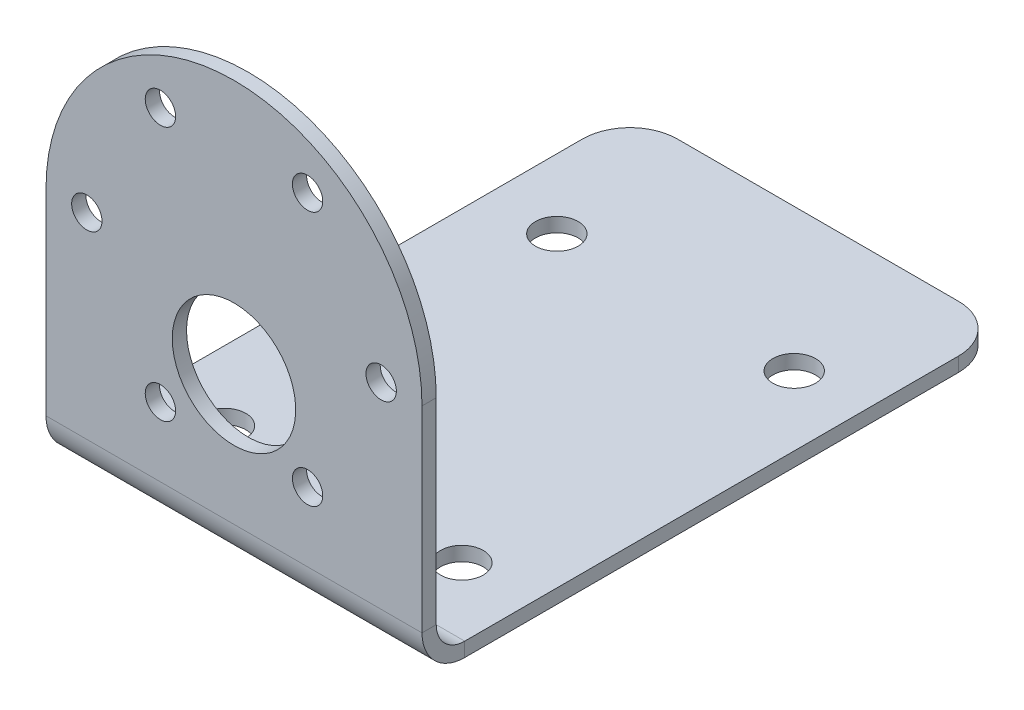
ISO-10303-21;
HEADER;
FILE_DESCRIPTION(('STEP AP214'),'2;1');
FILE_NAME('part.step','',(''),(''),'','','');
FILE_SCHEMA(('AUTOMOTIVE_DESIGN { 1 0 10303 214 1 1 1 1 }'));
ENDSEC;
DATA;
#1=APPLICATION_CONTEXT('core data for automotive mechanical design processes');
#2=APPLICATION_PROTOCOL_DEFINITION('international standard','automotive_design',2000,#1);
#3=PRODUCT_CONTEXT('',#1,'mechanical');
#4=PRODUCT('Part','Part','',(#3));
#5=PRODUCT_RELATED_PRODUCT_CATEGORY('part','',(#4));
#6=PRODUCT_DEFINITION_FORMATION('','',#4);
#7=PRODUCT_DEFINITION_CONTEXT('part definition',#1,'design');
#8=PRODUCT_DEFINITION('design','',#6,#7);
#9=PRODUCT_DEFINITION_SHAPE('','',#8);
#10=(LENGTH_UNIT() NAMED_UNIT(*) SI_UNIT(.MILLI.,.METRE.));
#11=(NAMED_UNIT(*) PLANE_ANGLE_UNIT() SI_UNIT($,.RADIAN.));
#12=(NAMED_UNIT(*) SI_UNIT($,.STERADIAN.) SOLID_ANGLE_UNIT());
#13=UNCERTAINTY_MEASURE_WITH_UNIT(LENGTH_MEASURE(1.E-05),#10,'distance_accuracy_value','');
#14=(GEOMETRIC_REPRESENTATION_CONTEXT(3) GLOBAL_UNCERTAINTY_ASSIGNED_CONTEXT((#13)) GLOBAL_UNIT_ASSIGNED_CONTEXT((#10,
#11,#12)) REPRESENTATION_CONTEXT('',''));
#15=CARTESIAN_POINT('',(0.,0.,0.));
#16=DIRECTION('',(0.,0.,1.));
#17=DIRECTION('',(1.,0.,0.));
#18=AXIS2_PLACEMENT_3D('',#15,#16,#17);
#19=CARTESIAN_POINT('',(19.8,-16.7,-60.));
#20=DIRECTION('',(1.,0.,0.));
#21=DIRECTION('',(0.,0.,1.));
#22=AXIS2_PLACEMENT_3D('',#19,#20,#21);
#23=PLANE('',#22);
#24=DIRECTION('',(0.,1.,0.));
#25=VECTOR('',#24,1.);
#26=CARTESIAN_POINT('',(19.8,-16.7,-3.));
#27=LINE('',#26,#25);
#28=CARTESIAN_POINT('',(19.8,-18.2,-3.));
#29=VERTEX_POINT('',#28);
#30=CARTESIAN_POINT('',(19.8,-16.7,-3.));
#31=VERTEX_POINT('',#30);
#32=EDGE_CURVE('E11',#29,#31,#27,.T.);
#33=ORIENTED_EDGE('',*,*,#32,.F.);
#34=DIRECTION('',(0.,0.,1.));
#35=VECTOR('',#34,1.);
#36=CARTESIAN_POINT('',(19.8,-18.2,-60.));
#37=LINE('',#36,#35);
#38=CARTESIAN_POINT('',(19.8,-18.2,-55.));
#39=VERTEX_POINT('',#38);
#40=EDGE_CURVE('E143',#39,#29,#37,.T.);
#41=ORIENTED_EDGE('',*,*,#40,.F.);
#42=DIRECTION('',(0.,1.,0.));
#43=VECTOR('',#42,1.);
#44=CARTESIAN_POINT('',(19.8,-16.7,-55.));
#45=LINE('',#44,#43);
#46=CARTESIAN_POINT('',(19.8,-16.7,-55.));
#47=VERTEX_POINT('',#46);
#48=EDGE_CURVE('E46',#39,#47,#45,.T.);
#49=ORIENTED_EDGE('',*,*,#48,.T.);
#50=DIRECTION('',(0.,0.,1.));
#51=VECTOR('',#50,1.);
#52=CARTESIAN_POINT('',(19.8,-16.7,-60.));
#53=LINE('',#52,#51);
#54=EDGE_CURVE('E204',#47,#31,#53,.T.);
#55=ORIENTED_EDGE('',*,*,#54,.T.);
#56=EDGE_LOOP('',(#33,#41,#49,#55));
#57=FACE_BOUND('',#56,.T.);
#58=ADVANCED_FACE('F36',(#57),#23,.T.);
#59=CARTESIAN_POINT('',(14.8,-16.7,-55.));
#60=DIRECTION('',(0.,-1.,0.));
#61=DIRECTION('',(1.,0.,0.));
#62=AXIS2_PLACEMENT_3D('',#59,#60,#61);
#63=CYLINDRICAL_SURFACE('',#62,5.);
#64=ORIENTED_EDGE('',*,*,#48,.F.);
#65=CARTESIAN_POINT('',(14.8,-18.2,-55.));
#66=DIRECTION('',(0.,1.,0.));
#67=DIRECTION('',(-1.,0.,0.));
#68=AXIS2_PLACEMENT_3D('',#65,#66,#67);
#69=CIRCLE('',#68,5.);
#70=CARTESIAN_POINT('',(14.8,-18.2,-60.));
#71=VERTEX_POINT('',#70);
#72=EDGE_CURVE('E151',#71,#39,#69,.F.);
#73=ORIENTED_EDGE('',*,*,#72,.F.);
#74=DIRECTION('',(0.,1.,0.));
#75=VECTOR('',#74,1.);
#76=CARTESIAN_POINT('',(14.8,-16.7,-60.));
#77=LINE('',#76,#75);
#78=CARTESIAN_POINT('',(14.8,-16.7,-60.));
#79=VERTEX_POINT('',#78);
#80=EDGE_CURVE('E198',#71,#79,#77,.T.);
#81=ORIENTED_EDGE('',*,*,#80,.T.);
#82=CARTESIAN_POINT('',(14.8,-16.7,-55.));
#83=DIRECTION('',(0.,1.,0.));
#84=DIRECTION('',(-1.,0.,0.));
#85=AXIS2_PLACEMENT_3D('',#82,#83,#84);
#86=CIRCLE('',#85,5.);
#87=EDGE_CURVE('E218',#79,#47,#86,.F.);
#88=ORIENTED_EDGE('',*,*,#87,.T.);
#89=EDGE_LOOP('',(#64,#73,#81,#88));
#90=FACE_BOUND('',#89,.T.);
#91=ADVANCED_FACE('F224',(#90),#63,.T.);
#92=CARTESIAN_POINT('',(0.,-16.7,-60.));
#93=DIRECTION('',(0.,0.,-1.));
#94=DIRECTION('',(1.,0.,0.));
#95=AXIS2_PLACEMENT_3D('',#92,#93,#94);
#96=PLANE('',#95);
#97=ORIENTED_EDGE('',*,*,#80,.F.);
#98=DIRECTION('',(1.,0.,0.));
#99=VECTOR('',#98,1.);
#100=CARTESIAN_POINT('',(0.,-18.2,-60.));
#101=LINE('',#100,#99);
#102=CARTESIAN_POINT('',(-14.8,-18.2,-60.));
#103=VERTEX_POINT('',#102);
#104=EDGE_CURVE('E147',#103,#71,#101,.T.);
#105=ORIENTED_EDGE('',*,*,#104,.F.);
#106=DIRECTION('',(0.,1.,0.));
#107=VECTOR('',#106,1.);
#108=CARTESIAN_POINT('',(-14.8,-16.7,-60.));
#109=LINE('',#108,#107);
#110=CARTESIAN_POINT('',(-14.8,-16.7,-60.));
#111=VERTEX_POINT('',#110);
#112=EDGE_CURVE('E195',#103,#111,#109,.T.);
#113=ORIENTED_EDGE('',*,*,#112,.T.);
#114=DIRECTION('',(1.,0.,0.));
#115=VECTOR('',#114,1.);
#116=CARTESIAN_POINT('',(0.,-16.7,-60.));
#117=LINE('',#116,#115);
#118=EDGE_CURVE('E276',#111,#79,#117,.T.);
#119=ORIENTED_EDGE('',*,*,#118,.T.);
#120=EDGE_LOOP('',(#97,#105,#113,#119));
#121=FACE_BOUND('',#120,.T.);
#122=ADVANCED_FACE('F298',(#121),#96,.T.);
#123=CARTESIAN_POINT('',(-14.8,-16.7,-55.));
#124=DIRECTION('',(0.,-1.,0.));
#125=DIRECTION('',(1.,0.,0.));
#126=AXIS2_PLACEMENT_3D('',#123,#124,#125);
#127=CYLINDRICAL_SURFACE('',#126,5.);
#128=ORIENTED_EDGE('',*,*,#112,.F.);
#129=CARTESIAN_POINT('',(-14.8,-18.2,-55.));
#130=DIRECTION('',(0.,-1.,0.));
#131=DIRECTION('',(1.,0.,0.));
#132=AXIS2_PLACEMENT_3D('',#129,#130,#131);
#133=CIRCLE('',#132,5.);
#134=CARTESIAN_POINT('',(-19.8,-18.2,-55.));
#135=VERTEX_POINT('',#134);
#136=EDGE_CURVE('E144',#103,#135,#133,.F.);
#137=ORIENTED_EDGE('',*,*,#136,.T.);
#138=DIRECTION('',(0.,1.,0.));
#139=VECTOR('',#138,1.);
#140=CARTESIAN_POINT('',(-19.8,-16.7,-55.));
#141=LINE('',#140,#139);
#142=CARTESIAN_POINT('',(-19.8,-16.7,-55.));
#143=VERTEX_POINT('',#142);
#144=EDGE_CURVE('E192',#135,#143,#141,.T.);
#145=ORIENTED_EDGE('',*,*,#144,.T.);
#146=CARTESIAN_POINT('',(-14.8,-16.7,-55.));
#147=DIRECTION('',(0.,-1.,0.));
#148=DIRECTION('',(1.,0.,0.));
#149=AXIS2_PLACEMENT_3D('',#146,#147,#148);
#150=CIRCLE('',#149,5.);
#151=EDGE_CURVE('E280',#111,#143,#150,.F.);
#152=ORIENTED_EDGE('',*,*,#151,.F.);
#153=EDGE_LOOP('',(#128,#137,#145,#152));
#154=FACE_BOUND('',#153,.T.);
#155=ADVANCED_FACE('F301',(#154),#127,.T.);
#156=CARTESIAN_POINT('',(-19.8,-16.7,-60.));
#157=DIRECTION('',(1.,0.,0.));
#158=DIRECTION('',(0.,0.,1.));
#159=AXIS2_PLACEMENT_3D('',#156,#157,#158);
#160=PLANE('',#159);
#161=ORIENTED_EDGE('',*,*,#144,.F.);
#162=DIRECTION('',(0.,0.,1.));
#163=VECTOR('',#162,1.);
#164=CARTESIAN_POINT('',(-19.8,-18.2,-60.));
#165=LINE('',#164,#163);
#166=CARTESIAN_POINT('',(-19.8,-18.2,-3.));
#167=VERTEX_POINT('',#166);
#168=EDGE_CURVE('E140',#135,#167,#165,.T.);
#169=ORIENTED_EDGE('',*,*,#168,.T.);
#170=DIRECTION('',(0.,1.,0.));
#171=VECTOR('',#170,1.);
#172=CARTESIAN_POINT('',(-19.8,-16.7,-3.));
#173=LINE('',#172,#171);
#174=CARTESIAN_POINT('',(-19.8,-16.7,-3.));
#175=VERTEX_POINT('',#174);
#176=EDGE_CURVE('E189',#167,#175,#173,.T.);
#177=ORIENTED_EDGE('',*,*,#176,.T.);
#178=DIRECTION('',(0.,0.,1.));
#179=VECTOR('',#178,1.);
#180=CARTESIAN_POINT('',(-19.8,-16.7,-60.));
#181=LINE('',#180,#179);
#182=EDGE_CURVE('E222',#143,#175,#181,.T.);
#183=ORIENTED_EDGE('',*,*,#182,.F.);
#184=EDGE_LOOP('',(#161,#169,#177,#183));
#185=FACE_BOUND('',#184,.T.);
#186=ADVANCED_FACE('F303',(#185),#160,.F.);
#187=CARTESIAN_POINT('',(-19.8,-13.7,-3.));
#188=DIRECTION('',(1.,0.,0.));
#189=DIRECTION('',(0.,1.,0.));
#190=AXIS2_PLACEMENT_3D('',#187,#188,#189);
#191=PLANE('',#190);
#192=ORIENTED_EDGE('',*,*,#176,.F.);
#193=CARTESIAN_POINT('',(-19.8,-13.7,-3.));
#194=DIRECTION('',(1.,0.,0.));
#195=DIRECTION('',(0.,1.,0.));
#196=AXIS2_PLACEMENT_3D('',#193,#194,#195);
#197=CIRCLE('',#196,4.5);
#198=CARTESIAN_POINT('',(-19.8,-13.7,1.5));
#199=VERTEX_POINT('',#198);
#200=EDGE_CURVE('E126',#167,#199,#197,.F.);
#201=ORIENTED_EDGE('',*,*,#200,.T.);
#202=DIRECTION('',(0.,0.,-1.));
#203=VECTOR('',#202,1.);
#204=CARTESIAN_POINT('',(-19.8,-13.7,0.));
#205=LINE('',#204,#203);
#206=CARTESIAN_POINT('',(-19.8,-13.7,0.));
#207=VERTEX_POINT('',#206);
#208=EDGE_CURVE('E54',#199,#207,#205,.T.);
#209=ORIENTED_EDGE('',*,*,#208,.T.);
#210=CARTESIAN_POINT('',(-19.8,-13.7,-3.));
#211=DIRECTION('',(-1.,0.,0.));
#212=DIRECTION('',(0.,-1.,0.));
#213=AXIS2_PLACEMENT_3D('',#210,#211,#212);
#214=CIRCLE('',#213,3.);
#215=EDGE_CURVE('E267',#175,#207,#214,.T.);
#216=ORIENTED_EDGE('',*,*,#215,.F.);
#217=EDGE_LOOP('',(#192,#201,#209,#216));
#218=FACE_BOUND('',#217,.T.);
#219=ADVANCED_FACE('F288',(#218),#191,.F.);
#220=CARTESIAN_POINT('',(-19.8,7.,0.));
#221=DIRECTION('',(1.,0.,0.));
#222=DIRECTION('',(0.,-1.,0.));
#223=AXIS2_PLACEMENT_3D('',#220,#221,#222);
#224=PLANE('',#223);
#225=ORIENTED_EDGE('',*,*,#208,.F.);
#226=DIRECTION('',(0.,1.,0.));
#227=VECTOR('',#226,1.);
#228=CARTESIAN_POINT('',(-19.8,0.,1.5));
#229=LINE('',#228,#227);
#230=CARTESIAN_POINT('',(-19.8,7.,1.5));
#231=VERTEX_POINT('',#230);
#232=EDGE_CURVE('E118',#231,#199,#229,.F.);
#233=ORIENTED_EDGE('',*,*,#232,.F.);
#234=DIRECTION('',(0.,0.,-1.));
#235=VECTOR('',#234,1.);
#236=CARTESIAN_POINT('',(-19.8,7.,0.));
#237=LINE('',#236,#235);
#238=CARTESIAN_POINT('',(-19.8,7.,0.));
#239=VERTEX_POINT('',#238);
#240=EDGE_CURVE('E185',#231,#239,#237,.T.);
#241=ORIENTED_EDGE('',*,*,#240,.T.);
#242=DIRECTION('',(0.,-1.,0.));
#243=VECTOR('',#242,1.);
#244=CARTESIAN_POINT('',(-19.8,7.,0.));
#245=LINE('',#244,#243);
#246=EDGE_CURVE('E239',#239,#207,#245,.T.);
#247=ORIENTED_EDGE('',*,*,#246,.T.);
#248=EDGE_LOOP('',(#225,#233,#241,#247));
#249=FACE_BOUND('',#248,.T.);
#250=ADVANCED_FACE('F394',(#249),#224,.F.);
#251=CARTESIAN_POINT('',(0.,7.,0.));
#252=DIRECTION('',(0.,0.,-1.));
#253=DIRECTION('',(-1.,0.,0.));
#254=AXIS2_PLACEMENT_3D('',#251,#252,#253);
#255=CYLINDRICAL_SURFACE('',#254,19.8);
#256=ORIENTED_EDGE('',*,*,#240,.F.);
#257=CARTESIAN_POINT('',(0.,7.,1.5));
#258=DIRECTION('',(0.,0.,1.));
#259=DIRECTION('',(1.,0.,0.));
#260=AXIS2_PLACEMENT_3D('',#257,#258,#259);
#261=CIRCLE('',#260,19.8);
#262=CARTESIAN_POINT('',(19.8,7.,1.5));
#263=VERTEX_POINT('',#262);
#264=EDGE_CURVE('E130',#263,#231,#261,.T.);
#265=ORIENTED_EDGE('',*,*,#264,.F.);
#266=DIRECTION('',(0.,0.,-1.));
#267=VECTOR('',#266,1.);
#268=CARTESIAN_POINT('',(19.8,7.,0.));
#269=LINE('',#268,#267);
#270=CARTESIAN_POINT('',(19.8,7.,0.));
#271=VERTEX_POINT('',#270);
#272=EDGE_CURVE('E105',#263,#271,#269,.T.);
#273=ORIENTED_EDGE('',*,*,#272,.T.);
#274=CARTESIAN_POINT('',(0.,7.,0.));
#275=DIRECTION('',(0.,0.,1.));
#276=DIRECTION('',(-1.,0.,0.));
#277=AXIS2_PLACEMENT_3D('',#274,#275,#276);
#278=CIRCLE('',#277,19.8);
#279=EDGE_CURVE('E234',#271,#239,#278,.T.);
#280=ORIENTED_EDGE('',*,*,#279,.T.);
#281=EDGE_LOOP('',(#256,#265,#273,#280));
#282=FACE_BOUND('',#281,.T.);
#283=ADVANCED_FACE('F391',(#282),#255,.T.);
#284=CARTESIAN_POINT('',(19.8,7.,0.));
#285=DIRECTION('',(1.,0.,0.));
#286=DIRECTION('',(0.,-1.,0.));
#287=AXIS2_PLACEMENT_3D('',#284,#285,#286);
#288=PLANE('',#287);
#289=ORIENTED_EDGE('',*,*,#272,.F.);
#290=DIRECTION('',(0.,1.,0.));
#291=VECTOR('',#290,1.);
#292=CARTESIAN_POINT('',(19.8,0.,1.5));
#293=LINE('',#292,#291);
#294=CARTESIAN_POINT('',(19.8,-13.7,1.5));
#295=VERTEX_POINT('',#294);
#296=EDGE_CURVE('E115',#263,#295,#293,.F.);
#297=ORIENTED_EDGE('',*,*,#296,.T.);
#298=DIRECTION('',(0.,0.,-1.));
#299=VECTOR('',#298,1.);
#300=CARTESIAN_POINT('',(19.8,-13.7,0.));
#301=LINE('',#300,#299);
#302=CARTESIAN_POINT('',(19.8,-13.7,0.));
#303=VERTEX_POINT('',#302);
#304=EDGE_CURVE('E40',#295,#303,#301,.T.);
#305=ORIENTED_EDGE('',*,*,#304,.T.);
#306=DIRECTION('',(0.,-1.,0.));
#307=VECTOR('',#306,1.);
#308=CARTESIAN_POINT('',(19.8,7.,0.));
#309=LINE('',#308,#307);
#310=EDGE_CURVE('E237',#271,#303,#309,.T.);
#311=ORIENTED_EDGE('',*,*,#310,.F.);
#312=EDGE_LOOP('',(#289,#297,#305,#311));
#313=FACE_BOUND('',#312,.T.);
#314=ADVANCED_FACE('F128',(#313),#288,.T.);
#315=CARTESIAN_POINT('',(-12.5,-16.7,-9.99999999999999));
#316=DIRECTION('',(0.,-1.,0.));
#317=DIRECTION('',(1.,0.,0.));
#318=AXIS2_PLACEMENT_3D('',#315,#316,#317);
#319=CYLINDRICAL_SURFACE('',#318,2.25);
#320=CARTESIAN_POINT('',(-12.5,-16.7,-9.99999999999999));
#321=DIRECTION('',(0.,1.,0.));
#322=DIRECTION('',(0.,0.,1.));
#323=AXIS2_PLACEMENT_3D('',#320,#321,#322);
#324=CIRCLE('',#323,2.25);
#325=CARTESIAN_POINT('',(-12.5,-16.7,-7.74999999999999));
#326=VERTEX_POINT('',#325);
#327=EDGE_CURVE('E268',#326,#326,#324,.T.);
#328=ORIENTED_EDGE('',*,*,#327,.T.);
#329=EDGE_LOOP('',(#328));
#330=FACE_BOUND('',#329,.T.);
#331=CARTESIAN_POINT('',(-12.5,-18.2,-9.99999999999999));
#332=DIRECTION('',(0.,1.,0.));
#333=DIRECTION('',(0.,0.,1.));
#334=AXIS2_PLACEMENT_3D('',#331,#332,#333);
#335=CIRCLE('',#334,2.25);
#336=CARTESIAN_POINT('',(-12.5,-18.2,-7.74999999999999));
#337=VERTEX_POINT('',#336);
#338=EDGE_CURVE('E139',#337,#337,#335,.T.);
#339=ORIENTED_EDGE('',*,*,#338,.F.);
#340=EDGE_LOOP('',(#339));
#341=FACE_BOUND('',#340,.T.);
#342=ADVANCED_FACE('F362',(#330,#341),#319,.F.);
#343=CARTESIAN_POINT('',(-12.5,-16.7,-45.));
#344=DIRECTION('',(0.,-1.,0.));
#345=DIRECTION('',(1.,0.,0.));
#346=AXIS2_PLACEMENT_3D('',#343,#344,#345);
#347=CYLINDRICAL_SURFACE('',#346,2.25);
#348=CARTESIAN_POINT('',(-12.5,-16.7,-45.));
#349=DIRECTION('',(0.,1.,0.));
#350=DIRECTION('',(0.,0.,1.));
#351=AXIS2_PLACEMENT_3D('',#348,#349,#350);
#352=CIRCLE('',#351,2.25);
#353=CARTESIAN_POINT('',(-12.5,-16.7,-42.75));
#354=VERTEX_POINT('',#353);
#355=EDGE_CURVE('E271',#354,#354,#352,.T.);
#356=ORIENTED_EDGE('',*,*,#355,.T.);
#357=EDGE_LOOP('',(#356));
#358=FACE_BOUND('',#357,.T.);
#359=CARTESIAN_POINT('',(-12.5,-18.2,-45.));
#360=DIRECTION('',(0.,1.,0.));
#361=DIRECTION('',(0.,0.,1.));
#362=AXIS2_PLACEMENT_3D('',#359,#360,#361);
#363=CIRCLE('',#362,2.25);
#364=CARTESIAN_POINT('',(-12.5,-18.2,-42.75));
#365=VERTEX_POINT('',#364);
#366=EDGE_CURVE('E150',#365,#365,#363,.T.);
#367=ORIENTED_EDGE('',*,*,#366,.F.);
#368=EDGE_LOOP('',(#367));
#369=FACE_BOUND('',#368,.T.);
#370=ADVANCED_FACE('F323',(#358,#369),#347,.F.);
#371=CARTESIAN_POINT('',(12.5,-16.7,-9.99999999999999));
#372=DIRECTION('',(0.,-1.,0.));
#373=DIRECTION('',(1.,0.,0.));
#374=AXIS2_PLACEMENT_3D('',#371,#372,#373);
#375=CYLINDRICAL_SURFACE('',#374,2.25);
#376=CARTESIAN_POINT('',(12.5,-16.7,-9.99999999999999));
#377=DIRECTION('',(0.,-1.,0.));
#378=DIRECTION('',(0.,0.,1.));
#379=AXIS2_PLACEMENT_3D('',#376,#377,#378);
#380=CIRCLE('',#379,2.25);
#381=CARTESIAN_POINT('',(12.5,-16.7,-7.74999999999999));
#382=VERTEX_POINT('',#381);
#383=EDGE_CURVE('E225',#382,#382,#380,.T.);
#384=ORIENTED_EDGE('',*,*,#383,.F.);
#385=EDGE_LOOP('',(#384));
#386=FACE_BOUND('',#385,.T.);
#387=CARTESIAN_POINT('',(12.5,-18.2,-9.99999999999999));
#388=DIRECTION('',(0.,-1.,0.));
#389=DIRECTION('',(0.,0.,-1.));
#390=AXIS2_PLACEMENT_3D('',#387,#388,#389);
#391=CIRCLE('',#390,2.25);
#392=CARTESIAN_POINT('',(12.5,-18.2,-12.25));
#393=VERTEX_POINT('',#392);
#394=EDGE_CURVE('E154',#393,#393,#391,.T.);
#395=ORIENTED_EDGE('',*,*,#394,.T.);
#396=EDGE_LOOP('',(#395));
#397=FACE_BOUND('',#396,.T.);
#398=ADVANCED_FACE('F315',(#386,#397),#375,.F.);
#399=CARTESIAN_POINT('',(12.5,-16.7,-45.));
#400=DIRECTION('',(0.,-1.,0.));
#401=DIRECTION('',(1.,0.,0.));
#402=AXIS2_PLACEMENT_3D('',#399,#400,#401);
#403=CYLINDRICAL_SURFACE('',#402,2.25);
#404=CARTESIAN_POINT('',(12.5,-16.7,-45.));
#405=DIRECTION('',(0.,-1.,0.));
#406=DIRECTION('',(0.,0.,1.));
#407=AXIS2_PLACEMENT_3D('',#404,#405,#406);
#408=CIRCLE('',#407,2.25);
#409=CARTESIAN_POINT('',(12.5,-16.7,-42.75));
#410=VERTEX_POINT('',#409);
#411=EDGE_CURVE('E228',#410,#410,#408,.T.);
#412=ORIENTED_EDGE('',*,*,#411,.F.);
#413=EDGE_LOOP('',(#412));
#414=FACE_BOUND('',#413,.T.);
#415=CARTESIAN_POINT('',(12.5,-18.2,-45.));
#416=DIRECTION('',(0.,-1.,0.));
#417=DIRECTION('',(0.,0.,-1.));
#418=AXIS2_PLACEMENT_3D('',#415,#416,#417);
#419=CIRCLE('',#418,2.25);
#420=CARTESIAN_POINT('',(12.5,-18.2,-47.25));
#421=VERTEX_POINT('',#420);
#422=EDGE_CURVE('E134',#421,#421,#419,.T.);
#423=ORIENTED_EDGE('',*,*,#422,.T.);
#424=EDGE_LOOP('',(#423));
#425=FACE_BOUND('',#424,.T.);
#426=ADVANCED_FACE('F38',(#414,#425),#403,.F.);
#427=CARTESIAN_POINT('',(19.8,-13.7,-3.));
#428=DIRECTION('',(-1.,0.,0.));
#429=DIRECTION('',(0.,-1.,0.));
#430=AXIS2_PLACEMENT_3D('',#427,#428,#429);
#431=PLANE('',#430);
#432=CARTESIAN_POINT('',(19.8,-13.7,-3.));
#433=DIRECTION('',(1.,0.,0.));
#434=DIRECTION('',(0.,1.,0.));
#435=AXIS2_PLACEMENT_3D('',#432,#433,#434);
#436=CIRCLE('',#435,4.5);
#437=EDGE_CURVE('E97',#295,#29,#436,.T.);
#438=ORIENTED_EDGE('',*,*,#437,.T.);
#439=ORIENTED_EDGE('',*,*,#32,.T.);
#440=CARTESIAN_POINT('',(19.8,-13.7,-3.));
#441=DIRECTION('',(1.,0.,0.));
#442=DIRECTION('',(0.,1.,0.));
#443=AXIS2_PLACEMENT_3D('',#440,#441,#442);
#444=CIRCLE('',#443,3.);
#445=EDGE_CURVE('E99',#303,#31,#444,.T.);
#446=ORIENTED_EDGE('',*,*,#445,.F.);
#447=ORIENTED_EDGE('',*,*,#304,.F.);
#448=EDGE_LOOP('',(#438,#439,#446,#447));
#449=FACE_BOUND('',#448,.T.);
#450=ADVANCED_FACE('F95',(#449),#431,.F.);
#451=CARTESIAN_POINT('',(0.,0.,0.));
#452=DIRECTION('',(0.,0.,-1.));
#453=DIRECTION('',(-1.,0.,0.));
#454=AXIS2_PLACEMENT_3D('',#451,#452,#453);
#455=CYLINDRICAL_SURFACE('',#454,6.5);
#456=CARTESIAN_POINT('',(0.,0.,0.));
#457=DIRECTION('',(0.,0.,-1.));
#458=DIRECTION('',(-1.,0.,0.));
#459=AXIS2_PLACEMENT_3D('',#456,#457,#458);
#460=CIRCLE('',#459,6.5);
#461=CARTESIAN_POINT('',(-6.5,0.,0.));
#462=VERTEX_POINT('',#461);
#463=EDGE_CURVE('E242',#462,#462,#460,.T.);
#464=ORIENTED_EDGE('',*,*,#463,.T.);
#465=EDGE_LOOP('',(#464));
#466=FACE_BOUND('',#465,.T.);
#467=CARTESIAN_POINT('',(0.,0.,1.5));
#468=DIRECTION('',(0.,0.,-1.));
#469=DIRECTION('',(-1.,0.,0.));
#470=AXIS2_PLACEMENT_3D('',#467,#468,#469);
#471=CIRCLE('',#470,6.5);
#472=CARTESIAN_POINT('',(-6.5,0.,1.5));
#473=VERTEX_POINT('',#472);
#474=EDGE_CURVE('E132',#473,#473,#471,.T.);
#475=ORIENTED_EDGE('',*,*,#474,.F.);
#476=EDGE_LOOP('',(#475));
#477=FACE_BOUND('',#476,.T.);
#478=ADVANCED_FACE('F321',(#466,#477),#455,.F.);
#479=CARTESIAN_POINT('',(-7.74999999999996,20.4233937586588,0.));
#480=DIRECTION('',(0.,0.,-1.));
#481=DIRECTION('',(-1.,0.,0.));
#482=AXIS2_PLACEMENT_3D('',#479,#480,#481);
#483=CYLINDRICAL_SURFACE('',#482,1.6);
#484=CARTESIAN_POINT('',(-7.74999999999996,20.4233937586588,0.));
#485=DIRECTION('',(0.,0.,1.));
#486=DIRECTION('',(0.499999999999998,-0.86602540378444,0.));
#487=AXIS2_PLACEMENT_3D('',#484,#485,#486);
#488=CIRCLE('',#487,1.6);
#489=CARTESIAN_POINT('',(-6.94999999999997,19.0377531126037,0.));
#490=VERTEX_POINT('',#489);
#491=EDGE_CURVE('E245',#490,#490,#488,.T.);
#492=ORIENTED_EDGE('',*,*,#491,.F.);
#493=EDGE_LOOP('',(#492));
#494=FACE_BOUND('',#493,.T.);
#495=CARTESIAN_POINT('',(-7.74999999999996,20.4233937586588,1.5));
#496=DIRECTION('',(0.,0.,1.));
#497=DIRECTION('',(1.,0.,0.));
#498=AXIS2_PLACEMENT_3D('',#495,#496,#497);
#499=CIRCLE('',#498,1.6);
#500=CARTESIAN_POINT('',(-6.14999999999996,20.4233937586588,1.5));
#501=VERTEX_POINT('',#500);
#502=EDGE_CURVE('E158',#501,#501,#499,.T.);
#503=ORIENTED_EDGE('',*,*,#502,.T.);
#504=EDGE_LOOP('',(#503));
#505=FACE_BOUND('',#504,.T.);
#506=ADVANCED_FACE('F336',(#494,#505),#483,.F.);
#507=CARTESIAN_POINT('',(-7.74999999999996,-6.42339375865882,0.));
#508=DIRECTION('',(0.,0.,-1.));
#509=DIRECTION('',(-1.,0.,0.));
#510=AXIS2_PLACEMENT_3D('',#507,#508,#509);
#511=CYLINDRICAL_SURFACE('',#510,1.6);
#512=CARTESIAN_POINT('',(-7.74999999999996,-6.42339375865882,0.));
#513=DIRECTION('',(0.,0.,1.));
#514=DIRECTION('',(0.499999999999998,0.86602540378444,0.));
#515=AXIS2_PLACEMENT_3D('',#512,#513,#514);
#516=CIRCLE('',#515,1.6);
#517=CARTESIAN_POINT('',(-6.94999999999997,-5.03775311260371,0.));
#518=VERTEX_POINT('',#517);
#519=EDGE_CURVE('E248',#518,#518,#516,.T.);
#520=ORIENTED_EDGE('',*,*,#519,.F.);
#521=EDGE_LOOP('',(#520));
#522=FACE_BOUND('',#521,.T.);
#523=CARTESIAN_POINT('',(-7.74999999999996,-6.42339375865882,1.5));
#524=DIRECTION('',(0.,0.,1.));
#525=DIRECTION('',(1.,0.,0.));
#526=AXIS2_PLACEMENT_3D('',#523,#524,#525);
#527=CIRCLE('',#526,1.6);
#528=CARTESIAN_POINT('',(-6.14999999999996,-6.42339375865882,1.5));
#529=VERTEX_POINT('',#528);
#530=EDGE_CURVE('E161',#529,#529,#527,.T.);
#531=ORIENTED_EDGE('',*,*,#530,.T.);
#532=EDGE_LOOP('',(#531));
#533=FACE_BOUND('',#532,.T.);
#534=ADVANCED_FACE('F340',(#522,#533),#511,.F.);
#535=CARTESIAN_POINT('',(-15.5,7.,0.));
#536=DIRECTION('',(0.,0.,-1.));
#537=DIRECTION('',(-1.,0.,0.));
#538=AXIS2_PLACEMENT_3D('',#535,#536,#537);
#539=CYLINDRICAL_SURFACE('',#538,1.6);
#540=CARTESIAN_POINT('',(-15.5,7.,0.));
#541=DIRECTION('',(0.,0.,1.));
#542=DIRECTION('',(1.,0.,0.));
#543=AXIS2_PLACEMENT_3D('',#540,#541,#542);
#544=CIRCLE('',#543,1.6);
#545=CARTESIAN_POINT('',(-13.9,7.,0.));
#546=VERTEX_POINT('',#545);
#547=EDGE_CURVE('E251',#546,#546,#544,.T.);
#548=ORIENTED_EDGE('',*,*,#547,.F.);
#549=EDGE_LOOP('',(#548));
#550=FACE_BOUND('',#549,.T.);
#551=CARTESIAN_POINT('',(-15.5,7.,1.5));
#552=DIRECTION('',(0.,0.,1.));
#553=DIRECTION('',(1.,0.,0.));
#554=AXIS2_PLACEMENT_3D('',#551,#552,#553);
#555=CIRCLE('',#554,1.6);
#556=CARTESIAN_POINT('',(-13.9,7.,1.5));
#557=VERTEX_POINT('',#556);
#558=EDGE_CURVE('E164',#557,#557,#555,.T.);
#559=ORIENTED_EDGE('',*,*,#558,.T.);
#560=EDGE_LOOP('',(#559));
#561=FACE_BOUND('',#560,.T.);
#562=ADVANCED_FACE('F344',(#550,#561),#539,.F.);
#563=CARTESIAN_POINT('',(7.74999999999996,20.4233937586588,0.));
#564=DIRECTION('',(0.,0.,-1.));
#565=DIRECTION('',(-1.,0.,0.));
#566=AXIS2_PLACEMENT_3D('',#563,#564,#565);
#567=CYLINDRICAL_SURFACE('',#566,1.6);
#568=CARTESIAN_POINT('',(7.74999999999996,20.4233937586588,0.));
#569=DIRECTION('',(0.,0.,-1.));
#570=DIRECTION('',(-0.499999999999998,-0.86602540378444,0.));
#571=AXIS2_PLACEMENT_3D('',#568,#569,#570);
#572=CIRCLE('',#571,1.6);
#573=CARTESIAN_POINT('',(6.94999999999997,19.0377531126037,0.));
#574=VERTEX_POINT('',#573);
#575=EDGE_CURVE('E254',#574,#574,#572,.T.);
#576=ORIENTED_EDGE('',*,*,#575,.T.);
#577=EDGE_LOOP('',(#576));
#578=FACE_BOUND('',#577,.T.);
#579=CARTESIAN_POINT('',(7.74999999999996,20.4233937586588,1.5));
#580=DIRECTION('',(0.,0.,-1.));
#581=DIRECTION('',(-1.,0.,0.));
#582=AXIS2_PLACEMENT_3D('',#579,#580,#581);
#583=CIRCLE('',#582,1.6);
#584=CARTESIAN_POINT('',(6.14999999999996,20.4233937586588,1.5));
#585=VERTEX_POINT('',#584);
#586=EDGE_CURVE('E167',#585,#585,#583,.T.);
#587=ORIENTED_EDGE('',*,*,#586,.F.);
#588=EDGE_LOOP('',(#587));
#589=FACE_BOUND('',#588,.T.);
#590=ADVANCED_FACE('F348',(#578,#589),#567,.F.);
#591=CARTESIAN_POINT('',(7.74999999999996,-6.42339375865882,0.));
#592=DIRECTION('',(0.,0.,-1.));
#593=DIRECTION('',(-1.,0.,0.));
#594=AXIS2_PLACEMENT_3D('',#591,#592,#593);
#595=CYLINDRICAL_SURFACE('',#594,1.6);
#596=CARTESIAN_POINT('',(7.74999999999996,-6.42339375865882,0.));
#597=DIRECTION('',(0.,0.,-1.));
#598=DIRECTION('',(-0.499999999999998,0.86602540378444,0.));
#599=AXIS2_PLACEMENT_3D('',#596,#597,#598);
#600=CIRCLE('',#599,1.6);
#601=CARTESIAN_POINT('',(6.94999999999997,-5.03775311260371,0.));
#602=VERTEX_POINT('',#601);
#603=EDGE_CURVE('E257',#602,#602,#600,.T.);
#604=ORIENTED_EDGE('',*,*,#603,.T.);
#605=EDGE_LOOP('',(#604));
#606=FACE_BOUND('',#605,.T.);
#607=CARTESIAN_POINT('',(7.74999999999996,-6.42339375865882,1.5));
#608=DIRECTION('',(0.,0.,-1.));
#609=DIRECTION('',(-1.,0.,0.));
#610=AXIS2_PLACEMENT_3D('',#607,#608,#609);
#611=CIRCLE('',#610,1.6);
#612=CARTESIAN_POINT('',(6.14999999999996,-6.42339375865882,1.5));
#613=VERTEX_POINT('',#612);
#614=EDGE_CURVE('E170',#613,#613,#611,.T.);
#615=ORIENTED_EDGE('',*,*,#614,.F.);
#616=EDGE_LOOP('',(#615));
#617=FACE_BOUND('',#616,.T.);
#618=ADVANCED_FACE('F352',(#606,#617),#595,.F.);
#619=CARTESIAN_POINT('',(15.5,7.,0.));
#620=DIRECTION('',(0.,0.,-1.));
#621=DIRECTION('',(-1.,0.,0.));
#622=AXIS2_PLACEMENT_3D('',#619,#620,#621);
#623=CYLINDRICAL_SURFACE('',#622,1.6);
#624=CARTESIAN_POINT('',(15.5,7.,0.));
#625=DIRECTION('',(0.,0.,-1.));
#626=DIRECTION('',(-1.,0.,0.));
#627=AXIS2_PLACEMENT_3D('',#624,#625,#626);
#628=CIRCLE('',#627,1.6);
#629=CARTESIAN_POINT('',(13.9,7.,0.));
#630=VERTEX_POINT('',#629);
#631=EDGE_CURVE('E260',#630,#630,#628,.T.);
#632=ORIENTED_EDGE('',*,*,#631,.T.);
#633=EDGE_LOOP('',(#632));
#634=FACE_BOUND('',#633,.T.);
#635=CARTESIAN_POINT('',(15.5,7.,1.5));
#636=DIRECTION('',(0.,0.,-1.));
#637=DIRECTION('',(-1.,0.,0.));
#638=AXIS2_PLACEMENT_3D('',#635,#636,#637);
#639=CIRCLE('',#638,1.6);
#640=CARTESIAN_POINT('',(13.9,7.,1.5));
#641=VERTEX_POINT('',#640);
#642=EDGE_CURVE('E173',#641,#641,#639,.T.);
#643=ORIENTED_EDGE('',*,*,#642,.F.);
#644=EDGE_LOOP('',(#643));
#645=FACE_BOUND('',#644,.T.);
#646=ADVANCED_FACE('F356',(#634,#645),#623,.F.);
#647=CARTESIAN_POINT('',(0.,0.,0.));
#648=DIRECTION('',(0.,0.,-1.));
#649=DIRECTION('',(-1.,0.,0.));
#650=AXIS2_PLACEMENT_3D('',#647,#648,#649);
#651=PLANE('',#650);
#652=ORIENTED_EDGE('',*,*,#310,.T.);
#653=DIRECTION('',(1.,0.,0.));
#654=VECTOR('',#653,1.);
#655=CARTESIAN_POINT('',(0.,-13.7,0.));
#656=LINE('',#655,#654);
#657=EDGE_CURVE('E106',#303,#207,#656,.F.);
#658=ORIENTED_EDGE('',*,*,#657,.T.);
#659=ORIENTED_EDGE('',*,*,#246,.F.);
#660=ORIENTED_EDGE('',*,*,#279,.F.);
#661=EDGE_LOOP('',(#652,#658,#659,#660));
#662=FACE_BOUND('',#661,.T.);
#663=ORIENTED_EDGE('',*,*,#463,.F.);
#664=EDGE_LOOP('',(#663));
#665=FACE_BOUND('',#664,.T.);
#666=ORIENTED_EDGE('',*,*,#491,.T.);
#667=EDGE_LOOP('',(#666));
#668=FACE_BOUND('',#667,.T.);
#669=ORIENTED_EDGE('',*,*,#519,.T.);
#670=EDGE_LOOP('',(#669));
#671=FACE_BOUND('',#670,.T.);
#672=ORIENTED_EDGE('',*,*,#547,.T.);
#673=EDGE_LOOP('',(#672));
#674=FACE_BOUND('',#673,.T.);
#675=ORIENTED_EDGE('',*,*,#575,.F.);
#676=EDGE_LOOP('',(#675));
#677=FACE_BOUND('',#676,.T.);
#678=ORIENTED_EDGE('',*,*,#603,.F.);
#679=EDGE_LOOP('',(#678));
#680=FACE_BOUND('',#679,.T.);
#681=ORIENTED_EDGE('',*,*,#631,.F.);
#682=EDGE_LOOP('',(#681));
#683=FACE_BOUND('',#682,.T.);
#684=ADVANCED_FACE('F360',(#662,#665,#668,#671,#674,#677,#680,#683),#651,.T.);
#685=CARTESIAN_POINT('',(0.,-16.7,-60.));
#686=DIRECTION('',(0.,-1.,0.));
#687=DIRECTION('',(1.,0.,0.));
#688=AXIS2_PLACEMENT_3D('',#685,#686,#687);
#689=PLANE('',#688);
#690=ORIENTED_EDGE('',*,*,#327,.F.);
#691=EDGE_LOOP('',(#690));
#692=FACE_BOUND('',#691,.T.);
#693=ORIENTED_EDGE('',*,*,#355,.F.);
#694=EDGE_LOOP('',(#693));
#695=FACE_BOUND('',#694,.T.);
#696=ORIENTED_EDGE('',*,*,#182,.T.);
#697=DIRECTION('',(1.,0.,0.));
#698=VECTOR('',#697,1.);
#699=CARTESIAN_POINT('',(0.,-16.7,-3.));
#700=LINE('',#699,#698);
#701=EDGE_CURVE('E221',#175,#31,#700,.T.);
#702=ORIENTED_EDGE('',*,*,#701,.T.);
#703=ORIENTED_EDGE('',*,*,#54,.F.);
#704=ORIENTED_EDGE('',*,*,#87,.F.);
#705=ORIENTED_EDGE('',*,*,#118,.F.);
#706=ORIENTED_EDGE('',*,*,#151,.T.);
#707=EDGE_LOOP('',(#696,#702,#703,#704,#705,#706));
#708=FACE_BOUND('',#707,.T.);
#709=ORIENTED_EDGE('',*,*,#383,.T.);
#710=EDGE_LOOP('',(#709));
#711=FACE_BOUND('',#710,.T.);
#712=ORIENTED_EDGE('',*,*,#411,.T.);
#713=EDGE_LOOP('',(#712));
#714=FACE_BOUND('',#713,.T.);
#715=ADVANCED_FACE('F215',(#692,#695,#708,#711,#714),#689,.F.);
#716=CARTESIAN_POINT('',(0.,-13.7,-3.));
#717=DIRECTION('',(1.,0.,0.));
#718=DIRECTION('',(0.,1.,0.));
#719=AXIS2_PLACEMENT_3D('',#716,#717,#718);
#720=CYLINDRICAL_SURFACE('',#719,3.);
#721=ORIENTED_EDGE('',*,*,#215,.T.);
#722=ORIENTED_EDGE('',*,*,#657,.F.);
#723=ORIENTED_EDGE('',*,*,#445,.T.);
#724=ORIENTED_EDGE('',*,*,#701,.F.);
#725=EDGE_LOOP('',(#721,#722,#723,#724));
#726=FACE_BOUND('',#725,.T.);
#727=ADVANCED_FACE('F289',(#726),#720,.F.);
#728=CARTESIAN_POINT('',(0.,0.,1.5));
#729=DIRECTION('',(0.,0.,-1.));
#730=DIRECTION('',(-1.,0.,0.));
#731=AXIS2_PLACEMENT_3D('',#728,#729,#730);
#732=PLANE('',#731);
#733=ORIENTED_EDGE('',*,*,#296,.F.);
#734=ORIENTED_EDGE('',*,*,#264,.T.);
#735=ORIENTED_EDGE('',*,*,#232,.T.);
#736=DIRECTION('',(-1.,0.,0.));
#737=VECTOR('',#736,1.);
#738=CARTESIAN_POINT('',(0.,-13.7,1.5));
#739=LINE('',#738,#737);
#740=EDGE_CURVE('E111',#295,#199,#739,.T.);
#741=ORIENTED_EDGE('',*,*,#740,.F.);
#742=EDGE_LOOP('',(#733,#734,#735,#741));
#743=FACE_BOUND('',#742,.T.);
#744=ORIENTED_EDGE('',*,*,#474,.T.);
#745=EDGE_LOOP('',(#744));
#746=FACE_BOUND('',#745,.T.);
#747=ORIENTED_EDGE('',*,*,#502,.F.);
#748=EDGE_LOOP('',(#747));
#749=FACE_BOUND('',#748,.T.);
#750=ORIENTED_EDGE('',*,*,#530,.F.);
#751=EDGE_LOOP('',(#750));
#752=FACE_BOUND('',#751,.T.);
#753=ORIENTED_EDGE('',*,*,#558,.F.);
#754=EDGE_LOOP('',(#753));
#755=FACE_BOUND('',#754,.T.);
#756=ORIENTED_EDGE('',*,*,#586,.T.);
#757=EDGE_LOOP('',(#756));
#758=FACE_BOUND('',#757,.T.);
#759=ORIENTED_EDGE('',*,*,#614,.T.);
#760=EDGE_LOOP('',(#759));
#761=FACE_BOUND('',#760,.T.);
#762=ORIENTED_EDGE('',*,*,#642,.T.);
#763=EDGE_LOOP('',(#762));
#764=FACE_BOUND('',#763,.T.);
#765=ADVANCED_FACE('F112',(#743,#746,#749,#752,#755,#758,#761,#764),#732,.F.);
#766=CARTESIAN_POINT('',(0.,-18.2,-60.));
#767=DIRECTION('',(0.,-1.,0.));
#768=DIRECTION('',(1.,0.,0.));
#769=AXIS2_PLACEMENT_3D('',#766,#767,#768);
#770=PLANE('',#769);
#771=ORIENTED_EDGE('',*,*,#338,.T.);
#772=EDGE_LOOP('',(#771));
#773=FACE_BOUND('',#772,.T.);
#774=ORIENTED_EDGE('',*,*,#366,.T.);
#775=EDGE_LOOP('',(#774));
#776=FACE_BOUND('',#775,.T.);
#777=ORIENTED_EDGE('',*,*,#168,.F.);
#778=ORIENTED_EDGE('',*,*,#136,.F.);
#779=ORIENTED_EDGE('',*,*,#104,.T.);
#780=ORIENTED_EDGE('',*,*,#72,.T.);
#781=ORIENTED_EDGE('',*,*,#40,.T.);
#782=DIRECTION('',(1.,0.,0.));
#783=VECTOR('',#782,1.);
#784=CARTESIAN_POINT('',(0.,-18.2,-3.));
#785=LINE('',#784,#783);
#786=EDGE_CURVE('E121',#167,#29,#785,.T.);
#787=ORIENTED_EDGE('',*,*,#786,.F.);
#788=EDGE_LOOP('',(#777,#778,#779,#780,#781,#787));
#789=FACE_BOUND('',#788,.T.);
#790=ORIENTED_EDGE('',*,*,#394,.F.);
#791=EDGE_LOOP('',(#790));
#792=FACE_BOUND('',#791,.T.);
#793=ORIENTED_EDGE('',*,*,#422,.F.);
#794=EDGE_LOOP('',(#793));
#795=FACE_BOUND('',#794,.T.);
#796=ADVANCED_FACE('F305',(#773,#776,#789,#792,#795),#770,.T.);
#797=CARTESIAN_POINT('',(0.,-13.7,-3.));
#798=DIRECTION('',(1.,0.,0.));
#799=DIRECTION('',(0.,1.,0.));
#800=AXIS2_PLACEMENT_3D('',#797,#798,#799);
#801=CYLINDRICAL_SURFACE('',#800,4.5);
#802=ORIENTED_EDGE('',*,*,#200,.F.);
#803=ORIENTED_EDGE('',*,*,#786,.T.);
#804=ORIENTED_EDGE('',*,*,#437,.F.);
#805=ORIENTED_EDGE('',*,*,#740,.T.);
#806=EDGE_LOOP('',(#802,#803,#804,#805));
#807=FACE_BOUND('',#806,.T.);
#808=ADVANCED_FACE('F123',(#807),#801,.T.);
#809=CLOSED_SHELL('',(#58,#91,#122,#155,#186,#219,#250,#283,#314,#342,#370,#398,#426,#450,#478,
#506,#534,#562,#590,#618,#646,#684,#715,#727,#765,#796,#808));
#810=MANIFOLD_SOLID_BREP('B2',#809);
#811=ADVANCED_BREP_SHAPE_REPRESENTATION('',(#18,#810),#14);
#812=SHAPE_DEFINITION_REPRESENTATION(#9,#811);
ENDSEC;
END-ISO-10303-21;
